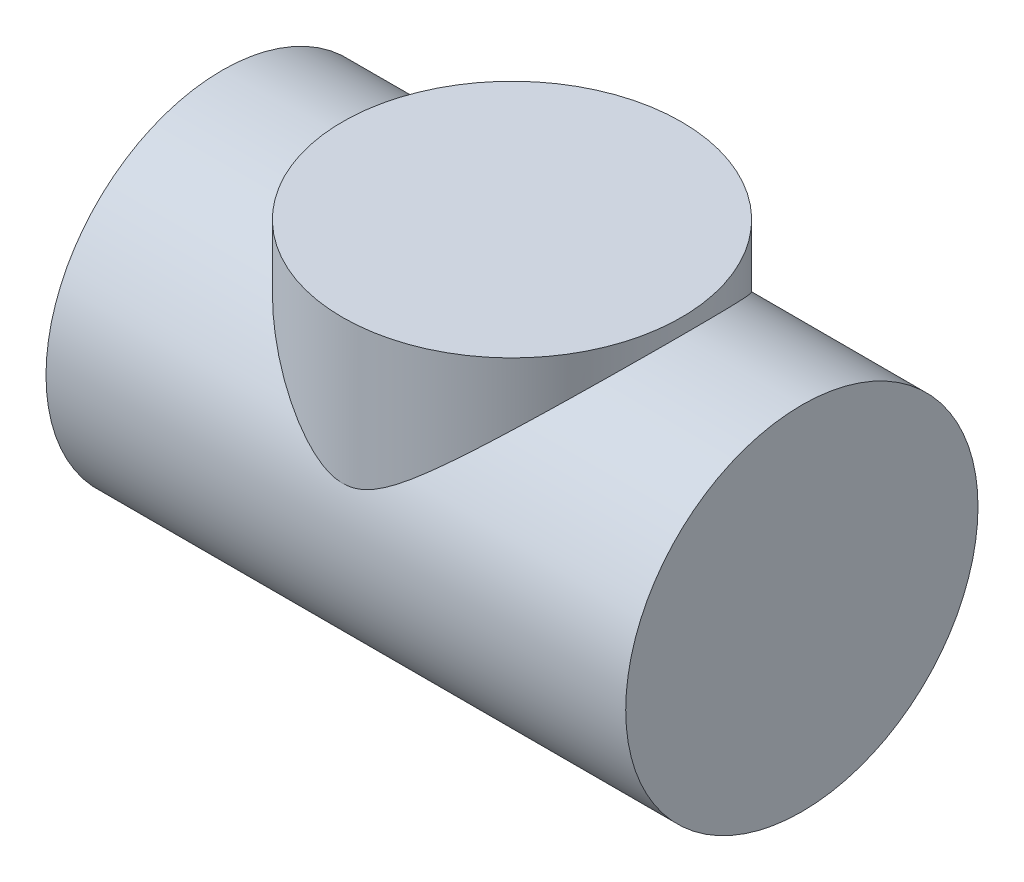
ISO-10303-21;
HEADER;
FILE_DESCRIPTION(('STEP AP214'),'2;1');
FILE_NAME('part.step','',(''),(''),'','','');
FILE_SCHEMA(('AUTOMOTIVE_DESIGN { 1 0 10303 214 1 1 1 1 }'));
ENDSEC;
DATA;
#1=APPLICATION_CONTEXT('core data for automotive mechanical design processes');
#2=APPLICATION_PROTOCOL_DEFINITION('international standard','automotive_design',2000,#1);
#3=PRODUCT_CONTEXT('',#1,'mechanical');
#4=PRODUCT('Part','Part','',(#3));
#5=PRODUCT_RELATED_PRODUCT_CATEGORY('part','',(#4));
#6=PRODUCT_DEFINITION_FORMATION('','',#4);
#7=PRODUCT_DEFINITION_CONTEXT('part definition',#1,'design');
#8=PRODUCT_DEFINITION('design','',#6,#7);
#9=PRODUCT_DEFINITION_SHAPE('','',#8);
#10=(LENGTH_UNIT() NAMED_UNIT(*) SI_UNIT(.MILLI.,.METRE.));
#11=(NAMED_UNIT(*) PLANE_ANGLE_UNIT() SI_UNIT($,.RADIAN.));
#12=(NAMED_UNIT(*) SI_UNIT($,.STERADIAN.) SOLID_ANGLE_UNIT());
#13=UNCERTAINTY_MEASURE_WITH_UNIT(LENGTH_MEASURE(1.E-05),#10,'distance_accuracy_value','');
#14=(GEOMETRIC_REPRESENTATION_CONTEXT(3) GLOBAL_UNCERTAINTY_ASSIGNED_CONTEXT((#13)) GLOBAL_UNIT_ASSIGNED_CONTEXT((#10,
#11,#12)) REPRESENTATION_CONTEXT('',''));
#15=CARTESIAN_POINT('',(0.,0.,0.));
#16=DIRECTION('',(0.,0.,1.));
#17=DIRECTION('',(1.,0.,0.));
#18=AXIS2_PLACEMENT_3D('',#15,#16,#17);
#19=CARTESIAN_POINT('',(0.065,0.,0.));
#20=DIRECTION('',(-1.,0.,0.));
#21=DIRECTION('',(0.,0.,1.));
#22=AXIS2_PLACEMENT_3D('',#19,#20,#21);
#23=CYLINDRICAL_SURFACE('',#22,0.0395);
#24=CARTESIAN_POINT('',(0.065,0.,0.));
#25=DIRECTION('',(1.,0.,0.));
#26=DIRECTION('',(0.,0.,-1.));
#27=AXIS2_PLACEMENT_3D('',#24,#25,#26);
#28=CIRCLE('',#27,0.0395);
#29=CARTESIAN_POINT('',(0.065,0.,-0.0395));
#30=VERTEX_POINT('',#29);
#31=EDGE_CURVE('E42',#30,#30,#28,.T.);
#32=ORIENTED_EDGE('',*,*,#31,.F.);
#33=EDGE_LOOP('',(#32));
#34=FACE_BOUND('',#33,.T.);
#35=CARTESIAN_POINT('',(-0.065,0.,0.));
#36=DIRECTION('',(1.,0.,0.));
#37=DIRECTION('',(0.,0.,-1.));
#38=AXIS2_PLACEMENT_3D('',#35,#36,#37);
#39=CIRCLE('',#38,0.0395);
#40=CARTESIAN_POINT('',(-0.065,0.,-0.0395));
#41=VERTEX_POINT('',#40);
#42=EDGE_CURVE('E46',#41,#41,#39,.T.);
#43=ORIENTED_EDGE('',*,*,#42,.T.);
#44=EDGE_LOOP('',(#43));
#45=FACE_BOUND('',#44,.T.);
#46=CARTESIAN_POINT('',(0.,0.0107819293264239,-0.038));
#47=CARTESIAN_POINT('',(-0.000703188866848206,0.0107820530636102,-0.0379999779063404));
#48=CARTESIAN_POINT('',(-0.00140658301615351,0.0108524075470229,-0.0379802004158841));
#49=CARTESIAN_POINT('',(-0.00278895153467149,0.0111158114970654,-0.0379039054973166));
#50=CARTESIAN_POINT('',(-0.00346781444686723,0.0113093608550417,-0.0378472383596153));
#51=CARTESIAN_POINT('',(-0.00521081396922638,0.0119318726174237,-0.0376568311504839));
#52=CARTESIAN_POINT('',(-0.00624536497602702,0.0124322672741572,-0.0374969940906376));
#53=CARTESIAN_POINT('',(-0.00823908700166016,0.013544634834061,-0.0371099804381249));
#54=CARTESIAN_POINT('',(-0.00919789816258634,0.0141570993248898,-0.0368825042890348));
#55=CARTESIAN_POINT('',(-0.0123438417241495,0.0163072206356726,-0.0360130522716107));
#56=CARTESIAN_POINT('',(-0.014411795134403,0.0179615714964762,-0.0352305182089266));
#57=CARTESIAN_POINT('',(-0.0183742133821329,0.0212802740400956,-0.0333338866245278));
#58=CARTESIAN_POINT('',(-0.0202686311398903,0.0229446283070714,-0.0322196994726345));
#59=CARTESIAN_POINT('',(-0.0237990648838008,0.0261161731142312,-0.0296999945858789));
#60=CARTESIAN_POINT('',(-0.0254430296287701,0.0276270736572938,-0.0283105748444702));
#61=CARTESIAN_POINT('',(-0.0285318287797572,0.030495944610213,-0.025193768895346));
#62=CARTESIAN_POINT('',(-0.029977026806227,0.0318541934229219,-0.0234670142019867));
#63=CARTESIAN_POINT('',(-0.0322427929291794,0.0339963378125138,-0.0201802212528106));
#64=CARTESIAN_POINT('',(-0.033126726496589,0.0348363642754757,-0.0187007031793754));
#65=CARTESIAN_POINT('',(-0.0347101007056976,0.0363453406976044,-0.0155653864949365));
#66=CARTESIAN_POINT('',(-0.0354097667651873,0.0370144996512873,-0.0139098067784063));
#67=CARTESIAN_POINT('',(-0.0364925139702333,0.0380517196562347,-0.0107100452894841));
#68=CARTESIAN_POINT('',(-0.0369073641989209,0.0384499117330828,-0.00918649064520242));
#69=CARTESIAN_POINT('',(-0.0375467573191483,0.039064062563964,-0.00606420753644546));
#70=CARTESIAN_POINT('',(-0.0377714098456988,0.0392801263012991,-0.0044655229406368));
#71=CARTESIAN_POINT('',(-0.0380146589648123,0.039514088115673,-0.00123287968537528));
#72=CARTESIAN_POINT('',(-0.0380326245884272,0.0395313793846388,0.000401171738466835));
#73=CARTESIAN_POINT('',(-0.0378594480506584,0.0393647972620534,0.00364769364105262));
#74=CARTESIAN_POINT('',(-0.0376682810832363,0.0391809000067409,0.00526016153672314));
#75=CARTESIAN_POINT('',(-0.037104490521086,0.0386391960628559,0.0083426974808899));
#76=CARTESIAN_POINT('',(-0.0367406379365258,0.0382897970260768,0.00981590334235912));
#77=CARTESIAN_POINT('',(-0.0358570117566317,0.0374427504091021,0.0126692308960631));
#78=CARTESIAN_POINT('',(-0.0353371825032259,0.0369450499100638,0.0140493191449114));
#79=CARTESIAN_POINT('',(-0.0339373564594877,0.0356080815618921,0.0172133380974664));
#80=CARTESIAN_POINT('',(-0.0329958979832021,0.034711238397868,0.0189457945397708));
#81=CARTESIAN_POINT('',(-0.0309169025708119,0.0327413084140914,0.022177848233534));
#82=CARTESIAN_POINT('',(-0.0297789321090334,0.0316678321758837,0.0236769163993274));
#83=CARTESIAN_POINT('',(-0.0269137924103795,0.0289872647061977,0.026943040613266));
#84=CARTESIAN_POINT('',(-0.0251225306816354,0.0273277534955553,0.0286104094780562));
#85=CARTESIAN_POINT('',(-0.0213349124915051,0.0238903487691534,0.0315369596871291));
#86=CARTESIAN_POINT('',(-0.019338404955831,0.0221123683959905,0.032795837481301));
#87=CARTESIAN_POINT('',(-0.0159979603582636,0.0192812365528902,0.0344965216564734));
#88=CARTESIAN_POINT('',(-0.014717032902579,0.0182260317273967,0.0350627915763685));
#89=CARTESIAN_POINT('',(-0.0120691462230731,0.0161614605163985,0.0360603461330594));
#90=CARTESIAN_POINT('',(-0.0107023480461453,0.0151520140954898,0.0364918748987672));
#91=CARTESIAN_POINT('',(-0.00853330282788448,0.0137392792887515,0.0370371653173857));
#92=CARTESIAN_POINT('',(-0.00778076345970524,0.0132804384630173,0.0372032697571482));
#93=CARTESIAN_POINT('',(-0.00622755373529493,0.0124340125178331,0.0374945686502809));
#94=CARTESIAN_POINT('',(-0.00542690819283628,0.0120463910742007,0.0376197839838875));
#95=CARTESIAN_POINT('',(-0.00398002380443275,0.0114791383434846,0.0377961023650371));
#96=CARTESIAN_POINT('',(-0.00334640240480207,0.0112716775573016,0.0378579590466279));
#97=CARTESIAN_POINT('',(-0.00205325015363757,0.0109579474691442,0.0379499809783539));
#98=CARTESIAN_POINT('',(-0.00139382026181919,0.0108513182883296,0.0379802589763516));
#99=CARTESIAN_POINT('',(-5.95640024296096E-05,0.0107614634409571,0.0380058429303612));
#100=CARTESIAN_POINT('',(0.000615345979014381,0.0107793061784324,0.0380008461007082));
#101=CARTESIAN_POINT('',(0.00195006480199533,0.0109366221773975,0.0379558434128863));
#102=CARTESIAN_POINT('',(0.00260983481856338,0.011076378576555,0.0379157560581823));
#103=CARTESIAN_POINT('',(0.00418354747164557,0.0115304938110171,0.0377805711888305));
#104=CARTESIAN_POINT('',(0.00508097367178106,0.011894718186563,0.0376689928668783));
#105=CARTESIAN_POINT('',(0.0068155920534893,0.0127330791371079,0.0373941255041581));
#106=CARTESIAN_POINT('',(0.00765245427150623,0.0132077659153,0.0372305760578212));
#107=CARTESIAN_POINT('',(0.0108627901637306,0.0151837509817951,0.0364979960326194));
#108=CARTESIAN_POINT('',(0.013067211162886,0.0168899231738964,0.0357579289385917));
#109=CARTESIAN_POINT('',(0.0172834977223429,0.0203413442798248,0.0339187086053098));
#110=CARTESIAN_POINT('',(0.0192947142358175,0.022086702165798,0.0328183962259005));
#111=CARTESIAN_POINT('',(0.023211024091449,0.0255759958366498,0.0301837658981893));
#112=CARTESIAN_POINT('',(0.025108389414007,0.0273169414406321,0.0286335082754885));
#113=CARTESIAN_POINT('',(0.0286431303892673,0.0305987351650431,0.0250952035449589));
#114=CARTESIAN_POINT('',(0.0302815613993888,0.0321403906060988,0.0231090167192279));
#115=CARTESIAN_POINT('',(0.0326451594580732,0.0343783430838168,0.0195197929123155));
#116=CARTESIAN_POINT('',(0.0334822666450241,0.0351747266702811,0.0180528356680713));
#117=CARTESIAN_POINT('',(0.0349765359658097,0.0365999740054227,0.0149531085131075));
#118=CARTESIAN_POINT('',(0.0356337755746386,0.0372289098762631,0.0133204104093019));
#119=CARTESIAN_POINT('',(0.0367318598377125,0.0382812562210627,0.00990059333009964));
#120=CARTESIAN_POINT('',(0.0371705933594652,0.0387026611815987,0.00811215682977138));
#121=CARTESIAN_POINT('',(0.0377839622508099,0.0392921169013008,0.00445027215816082));
#122=CARTESIAN_POINT('',(0.0379588954581056,0.0394604533809752,0.00257692232255536));
#123=CARTESIAN_POINT('',(0.0380234227569686,0.0395225359491714,-0.000917730008192386));
#124=CARTESIAN_POINT('',(0.0379492617449889,0.0394511617237037,-0.00253791445184149));
#125=CARTESIAN_POINT('',(0.0375990782985526,0.0391144266935542,-0.00573543533798167));
#126=CARTESIAN_POINT('',(0.0373230465134514,0.0388490569030075,-0.00731276979215308));
#127=CARTESIAN_POINT('',(0.0365989855967463,0.0381539743532912,-0.0103375856241568));
#128=CARTESIAN_POINT('',(0.0361561932347531,0.0377292666850389,-0.0117875095988787));
#129=CARTESIAN_POINT('',(0.0351224786925447,0.0367398481997853,-0.0145819979924599));
#130=CARTESIAN_POINT('',(0.0345315102166633,0.0361750936275892,-0.0159265293101209));
#131=CARTESIAN_POINT('',(0.0329298100004699,0.0346487754192505,-0.0190791188463829));
#132=CARTESIAN_POINT('',(0.031850177722613,0.0336233303051722,-0.0208213742760377));
#133=CARTESIAN_POINT('',(0.0294935232761016,0.0314001244605326,-0.0240445420338214));
#134=CARTESIAN_POINT('',(0.0282159677512885,0.0302018987498732,-0.0255247243339769));
#135=CARTESIAN_POINT('',(0.0250242822752688,0.0272391953233956,-0.0287150450331904));
#136=CARTESIAN_POINT('',(0.0230464867047795,0.0254260836433218,-0.0303163427412993));
#137=CARTESIAN_POINT('',(0.0188800450826958,0.0217208576325741,-0.0330726618803405));
#138=CARTESIAN_POINT('',(0.0166915339301115,0.0198287942802561,-0.0342279664912974));
#139=CARTESIAN_POINT('',(0.0124411750912933,0.0164167233213783,-0.0359676350809329));
#140=CARTESIAN_POINT('',(0.0104159330926512,0.0148859699649006,-0.036614066393527));
#141=CARTESIAN_POINT('',(0.00749348012255828,0.0131186100960328,-0.0372611557308777));
#142=CARTESIAN_POINT('',(0.00674248521876075,0.0126986859997743,-0.0374052831225511));
#143=CARTESIAN_POINT('',(0.00519048213001661,0.0119467149913933,-0.0376520569545706));
#144=CARTESIAN_POINT('',(0.00438957874587789,0.0116144911282606,-0.0377547871453184));
#145=CARTESIAN_POINT('',(0.00298733200460472,0.0111749462004728,-0.0378867792611055));
#146=CARTESIAN_POINT('',(0.00239942205554742,0.0110299508726992,-0.0379288848078193));
#147=CARTESIAN_POINT('',(0.00120769274092584,0.0108335186197698,-0.0379854664717693));
#148=CARTESIAN_POINT('',(0.000603922078098461,0.0107818230567967,-0.0380000189747726));
#149=CARTESIAN_POINT('',(0.,0.0107819293264239,-0.038));
#150=B_SPLINE_CURVE_WITH_KNOTS('',3,(#46,#47,#48,#49,#50,#51,#52,#53,#54,#55,#56,#57,#58,#59,
#60,#61,#62,#63,#64,#65,#66,#67,#68,#69,#70,#71,#72,#73,#74,#75,#76,#77,#78,#79,#80,#81,#82,#83,
#84,#85,#86,#87,#88,#89,#90,#91,#92,#93,#94,#95,#96,#97,#98,#99,#100,#101,#102,#103,#104,#105,
#106,#107,#108,#109,#110,#111,#112,#113,#114,#115,#116,#117,#118,#119,#120,#121,#122,#123,#124,
#125,#126,#127,#128,#129,#130,#131,#132,#133,#134,#135,#136,#137,#138,#139,#140,#141,#142,#143,
#144,#145,#146,#147,#148,#149),.UNSPECIFIED.,.T.,.F.,(4,2,2,2,2,2,2,2,2,2,2,2,2,2,2,2,2,2,2,2,2,
2,2,2,2,2,2,2,2,2,2,2,2,2,2,2,2,2,2,2,2,2,2,2,2,2,2,2,2,2,2,4),(0.,0.00210685488747647,
0.00422231379906487,0.00768330340332071,0.0111598551310592,0.0194052068821683,
0.0276527889890021,0.035513896822009,0.0433604267553477,0.0490919509062797,0.054816430664626,
0.0596809577888981,0.0645426789576087,0.0694192379508607,0.074296375434657,0.078948686932087,
0.0836026605194599,0.0900651708045585,0.0965421245681838,0.105365754447384,0.114195926238268,
0.119451494791152,0.124697485105831,0.127385384431838,0.130071909013679,0.132074119795806,
0.134069157196673,0.136081339932042,0.138098208328499,0.14100632059696,0.143929240262567,
0.152523417339938,0.161145523725391,0.17012101286211,0.179058920032797,0.18464145222022,
0.190221576025729,0.195854615056909,0.201481289460279,0.20632674399432,0.211172422983799,
0.215877146815817,0.220583342412209,0.227420637035871,0.234276687747607,0.243599220041176,
0.252915823287499,0.260728107577111,0.263341512133369,0.265949602659203,0.26776407769127,
0.269573515015839),.UNSPECIFIED.);
#151=CARTESIAN_POINT('',(0.,0.0107819293264239,-0.038));
#152=VERTEX_POINT('',#151);
#153=EDGE_CURVE('E10',#152,#152,#150,.T.);
#154=ORIENTED_EDGE('',*,*,#153,.F.);
#155=EDGE_LOOP('',(#154));
#156=FACE_BOUND('',#155,.T.);
#157=ADVANCED_FACE('F31',(#34,#45,#156),#23,.T.);
#158=CARTESIAN_POINT('',(0.065,0.,0.));
#159=DIRECTION('',(1.,0.,0.));
#160=DIRECTION('',(0.,0.,-1.));
#161=AXIS2_PLACEMENT_3D('',#158,#159,#160);
#162=PLANE('',#161);
#163=ORIENTED_EDGE('',*,*,#31,.T.);
#164=EDGE_LOOP('',(#163));
#165=FACE_BOUND('',#164,.T.);
#166=ADVANCED_FACE('F66',(#165),#162,.T.);
#167=CARTESIAN_POINT('',(-0.065,0.,0.));
#168=DIRECTION('',(1.,0.,0.));
#169=DIRECTION('',(0.,0.,-1.));
#170=AXIS2_PLACEMENT_3D('',#167,#168,#169);
#171=PLANE('',#170);
#172=ORIENTED_EDGE('',*,*,#42,.F.);
#173=EDGE_LOOP('',(#172));
#174=FACE_BOUND('',#173,.T.);
#175=ADVANCED_FACE('F60',(#174),#171,.F.);
#176=CARTESIAN_POINT('',(0.,0.043,0.));
#177=DIRECTION('',(0.,-1.,0.));
#178=DIRECTION('',(0.,0.,-1.));
#179=AXIS2_PLACEMENT_3D('',#176,#177,#178);
#180=CYLINDRICAL_SURFACE('',#179,0.038);
#181=CARTESIAN_POINT('',(0.,0.043,0.));
#182=DIRECTION('',(0.,1.,0.));
#183=DIRECTION('',(0.,0.,1.));
#184=AXIS2_PLACEMENT_3D('',#181,#182,#183);
#185=CIRCLE('',#184,0.038);
#186=CARTESIAN_POINT('',(0.,0.043,0.038));
#187=VERTEX_POINT('',#186);
#188=EDGE_CURVE('E51',#187,#187,#185,.T.);
#189=ORIENTED_EDGE('',*,*,#188,.F.);
#190=EDGE_LOOP('',(#189));
#191=FACE_BOUND('',#190,.T.);
#192=ORIENTED_EDGE('',*,*,#153,.T.);
#193=EDGE_LOOP('',(#192));
#194=FACE_BOUND('',#193,.T.);
#195=ADVANCED_FACE('F58',(#191,#194),#180,.T.);
#196=CARTESIAN_POINT('',(0.,0.043,0.));
#197=DIRECTION('',(0.,1.,0.));
#198=DIRECTION('',(0.,0.,1.));
#199=AXIS2_PLACEMENT_3D('',#196,#197,#198);
#200=PLANE('',#199);
#201=ORIENTED_EDGE('',*,*,#188,.T.);
#202=EDGE_LOOP('',(#201));
#203=FACE_BOUND('',#202,.T.);
#204=ADVANCED_FACE('F56',(#203),#200,.T.);
#205=CLOSED_SHELL('',(#157,#166,#175,#195,#204));
#206=MANIFOLD_SOLID_BREP('B2',#205);
#207=ADVANCED_BREP_SHAPE_REPRESENTATION('',(#18,#206),#14);
#208=SHAPE_DEFINITION_REPRESENTATION(#9,#207);
ENDSEC;
END-ISO-10303-21;
